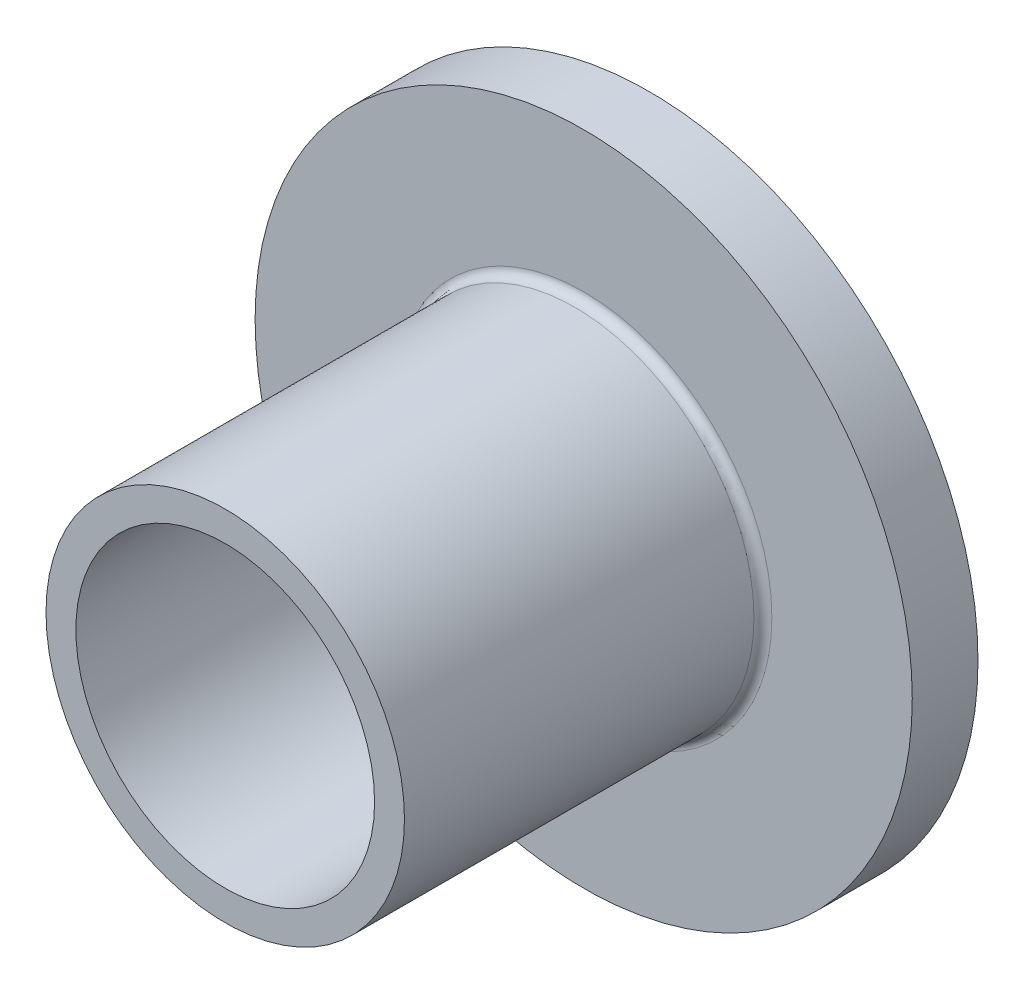
ISO-10303-21;
HEADER;
FILE_DESCRIPTION(('STEP AP214'),'2;1');
FILE_NAME('part.step','',(''),(''),'','','');
FILE_SCHEMA(('AUTOMOTIVE_DESIGN { 1 0 10303 214 1 1 1 1 }'));
ENDSEC;
DATA;
#1=APPLICATION_CONTEXT('core data for automotive mechanical design processes');
#2=APPLICATION_PROTOCOL_DEFINITION('international standard','automotive_design',2000,#1);
#3=PRODUCT_CONTEXT('',#1,'mechanical');
#4=PRODUCT('Part','Part','',(#3));
#5=PRODUCT_RELATED_PRODUCT_CATEGORY('part','',(#4));
#6=PRODUCT_DEFINITION_FORMATION('','',#4);
#7=PRODUCT_DEFINITION_CONTEXT('part definition',#1,'design');
#8=PRODUCT_DEFINITION('design','',#6,#7);
#9=PRODUCT_DEFINITION_SHAPE('','',#8);
#10=(LENGTH_UNIT() NAMED_UNIT(*) SI_UNIT(.MILLI.,.METRE.));
#11=(NAMED_UNIT(*) PLANE_ANGLE_UNIT() SI_UNIT($,.RADIAN.));
#12=(NAMED_UNIT(*) SI_UNIT($,.STERADIAN.) SOLID_ANGLE_UNIT());
#13=UNCERTAINTY_MEASURE_WITH_UNIT(LENGTH_MEASURE(1.E-05),#10,'distance_accuracy_value','');
#14=(GEOMETRIC_REPRESENTATION_CONTEXT(3) GLOBAL_UNCERTAINTY_ASSIGNED_CONTEXT((#13)) GLOBAL_UNIT_ASSIGNED_CONTEXT((#10,
#11,#12)) REPRESENTATION_CONTEXT('',''));
#15=CARTESIAN_POINT('',(0.,0.,0.));
#16=DIRECTION('',(0.,0.,1.));
#17=DIRECTION('',(1.,0.,0.));
#18=AXIS2_PLACEMENT_3D('',#15,#16,#17);
#19=CARTESIAN_POINT('',(0.,0.,22.));
#20=DIRECTION('',(0.,0.,-1.));
#21=DIRECTION('',(-1.,0.,0.));
#22=AXIS2_PLACEMENT_3D('',#19,#20,#21);
#23=CYLINDRICAL_SURFACE('',#22,110.);
#24=CARTESIAN_POINT('',(0.,0.,22.));
#25=DIRECTION('',(0.,0.,1.));
#26=DIRECTION('',(1.,0.,0.));
#27=AXIS2_PLACEMENT_3D('',#24,#25,#26);
#28=CIRCLE('',#27,110.);
#29=CARTESIAN_POINT('',(110.,0.,22.));
#30=VERTEX_POINT('',#29);
#31=EDGE_CURVE('E54',#30,#30,#28,.T.);
#32=ORIENTED_EDGE('',*,*,#31,.F.);
#33=EDGE_LOOP('',(#32));
#34=FACE_BOUND('',#33,.T.);
#35=CARTESIAN_POINT('',(0.,0.,0.));
#36=DIRECTION('',(0.,0.,1.));
#37=DIRECTION('',(1.,0.,0.));
#38=AXIS2_PLACEMENT_3D('',#35,#36,#37);
#39=CIRCLE('',#38,110.);
#40=CARTESIAN_POINT('',(110.,0.,0.));
#41=VERTEX_POINT('',#40);
#42=EDGE_CURVE('E58',#41,#41,#39,.T.);
#43=ORIENTED_EDGE('',*,*,#42,.T.);
#44=EDGE_LOOP('',(#43));
#45=FACE_BOUND('',#44,.T.);
#46=ADVANCED_FACE('F43',(#34,#45),#23,.T.);
#47=CARTESIAN_POINT('',(0.,0.,22.));
#48=DIRECTION('',(0.,0.,1.));
#49=DIRECTION('',(1.,0.,0.));
#50=AXIS2_PLACEMENT_3D('',#47,#48,#49);
#51=PLANE('',#50);
#52=CARTESIAN_POINT('',(0.,0.,22.));
#53=DIRECTION('',(0.,0.,1.));
#54=DIRECTION('',(1.,0.,0.));
#55=AXIS2_PLACEMENT_3D('',#52,#53,#54);
#56=CIRCLE('',#55,63.);
#57=CARTESIAN_POINT('',(63.,0.,22.));
#58=VERTEX_POINT('',#57);
#59=EDGE_CURVE('E12',#58,#58,#56,.F.);
#60=ORIENTED_EDGE('',*,*,#59,.T.);
#61=EDGE_LOOP('',(#60));
#62=FACE_BOUND('',#61,.T.);
#63=ORIENTED_EDGE('',*,*,#31,.T.);
#64=EDGE_LOOP('',(#63));
#65=FACE_BOUND('',#64,.T.);
#66=ADVANCED_FACE('F89',(#62,#65),#51,.T.);
#67=CARTESIAN_POINT('',(0.,0.,0.));
#68=DIRECTION('',(0.,0.,1.));
#69=DIRECTION('',(1.,0.,0.));
#70=AXIS2_PLACEMENT_3D('',#67,#68,#69);
#71=PLANE('',#70);
#72=CARTESIAN_POINT('',(0.,0.,0.));
#73=DIRECTION('',(0.,0.,1.));
#74=DIRECTION('',(1.,0.,0.));
#75=AXIS2_PLACEMENT_3D('',#72,#73,#74);
#76=CIRCLE('',#75,50.);
#77=CARTESIAN_POINT('',(50.,0.,0.));
#78=VERTEX_POINT('',#77);
#79=EDGE_CURVE('E66',#78,#78,#76,.F.);
#80=ORIENTED_EDGE('',*,*,#79,.F.);
#81=EDGE_LOOP('',(#80));
#82=FACE_BOUND('',#81,.T.);
#83=ORIENTED_EDGE('',*,*,#42,.F.);
#84=EDGE_LOOP('',(#83));
#85=FACE_BOUND('',#84,.T.);
#86=ADVANCED_FACE('F84',(#82,#85),#71,.F.);
#87=CARTESIAN_POINT('',(0.,0.,0.));
#88=DIRECTION('',(0.,0.,1.));
#89=DIRECTION('',(1.,0.,0.));
#90=AXIS2_PLACEMENT_3D('',#87,#88,#89);
#91=CYLINDRICAL_SURFACE('',#90,60.);
#92=CARTESIAN_POINT('',(0.,0.,25.));
#93=DIRECTION('',(0.,0.,1.));
#94=DIRECTION('',(1.,0.,0.));
#95=AXIS2_PLACEMENT_3D('',#92,#93,#94);
#96=CIRCLE('',#95,60.);
#97=CARTESIAN_POINT('',(60.,0.,25.));
#98=VERTEX_POINT('',#97);
#99=EDGE_CURVE('E50',#98,#98,#96,.T.);
#100=ORIENTED_EDGE('',*,*,#99,.T.);
#101=EDGE_LOOP('',(#100));
#102=FACE_BOUND('',#101,.T.);
#103=CARTESIAN_POINT('',(0.,0.,142.));
#104=DIRECTION('',(0.,0.,1.));
#105=DIRECTION('',(1.,0.,0.));
#106=AXIS2_PLACEMENT_3D('',#103,#104,#105);
#107=CIRCLE('',#106,60.);
#108=CARTESIAN_POINT('',(60.,0.,142.));
#109=VERTEX_POINT('',#108);
#110=EDGE_CURVE('E62',#109,#109,#107,.T.);
#111=ORIENTED_EDGE('',*,*,#110,.F.);
#112=EDGE_LOOP('',(#111));
#113=FACE_BOUND('',#112,.T.);
#114=ADVANCED_FACE('F79',(#102,#113),#91,.T.);
#115=CARTESIAN_POINT('',(0.,0.,142.));
#116=DIRECTION('',(0.,0.,1.));
#117=DIRECTION('',(1.,0.,0.));
#118=AXIS2_PLACEMENT_3D('',#115,#116,#117);
#119=PLANE('',#118);
#120=CARTESIAN_POINT('',(0.,0.,142.));
#121=DIRECTION('',(0.,0.,1.));
#122=DIRECTION('',(1.,0.,0.));
#123=AXIS2_PLACEMENT_3D('',#120,#121,#122);
#124=CIRCLE('',#123,50.);
#125=CARTESIAN_POINT('',(50.,0.,142.));
#126=VERTEX_POINT('',#125);
#127=EDGE_CURVE('E69',#126,#126,#124,.T.);
#128=ORIENTED_EDGE('',*,*,#127,.F.);
#129=EDGE_LOOP('',(#128));
#130=FACE_BOUND('',#129,.T.);
#131=ORIENTED_EDGE('',*,*,#110,.T.);
#132=EDGE_LOOP('',(#131));
#133=FACE_BOUND('',#132,.T.);
#134=ADVANCED_FACE('F76',(#130,#133),#119,.T.);
#135=CARTESIAN_POINT('',(0.,0.,142.));
#136=DIRECTION('',(0.,0.,-1.));
#137=DIRECTION('',(-1.,0.,0.));
#138=AXIS2_PLACEMENT_3D('',#135,#136,#137);
#139=CYLINDRICAL_SURFACE('',#138,50.);
#140=ORIENTED_EDGE('',*,*,#127,.T.);
#141=EDGE_LOOP('',(#140));
#142=FACE_BOUND('',#141,.T.);
#143=ORIENTED_EDGE('',*,*,#79,.T.);
#144=EDGE_LOOP('',(#143));
#145=FACE_BOUND('',#144,.T.);
#146=ADVANCED_FACE('F73',(#142,#145),#139,.F.);
#147=CARTESIAN_POINT('',(0.,0.,25.));
#148=DIRECTION('',(0.,0.,1.));
#149=DIRECTION('',(1.,0.,0.));
#150=AXIS2_PLACEMENT_3D('',#147,#148,#149);
#151=TOROIDAL_SURFACE('',#150,63.,3.);
#152=ORIENTED_EDGE('',*,*,#59,.F.);
#153=EDGE_LOOP('',(#152));
#154=FACE_BOUND('',#153,.T.);
#155=ORIENTED_EDGE('',*,*,#99,.F.);
#156=EDGE_LOOP('',(#155));
#157=FACE_BOUND('',#156,.T.);
#158=ADVANCED_FACE('F45',(#154,#157),#151,.F.);
#159=CLOSED_SHELL('',(#46,#66,#86,#114,#134,#146,#158));
#160=MANIFOLD_SOLID_BREP('B2',#159);
#161=ADVANCED_BREP_SHAPE_REPRESENTATION('',(#18,#160),#14);
#162=SHAPE_DEFINITION_REPRESENTATION(#9,#161);
ENDSEC;
END-ISO-10303-21;
